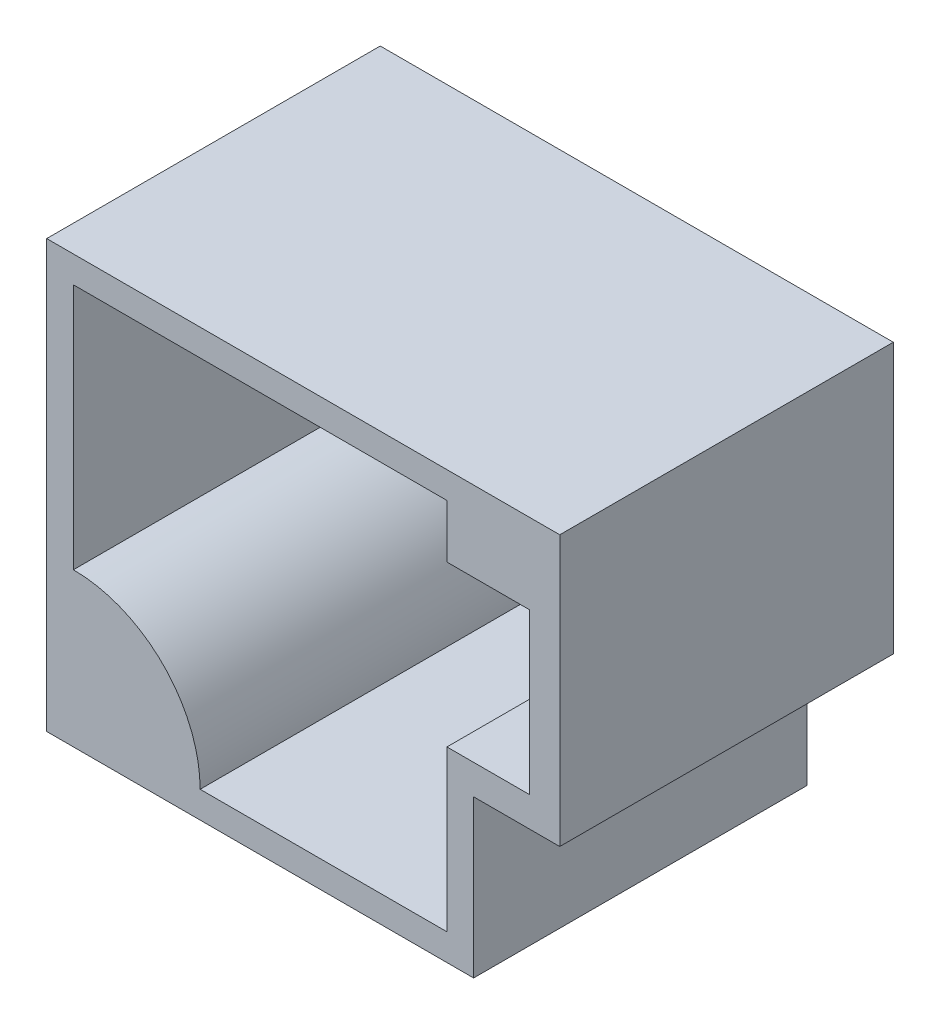
ISO-10303-21;
HEADER;
FILE_DESCRIPTION(('STEP AP214'),'2;1');
FILE_NAME('part.step','',(''),(''),'','','');
FILE_SCHEMA(('AUTOMOTIVE_DESIGN { 1 0 10303 214 1 1 1 1 }'));
ENDSEC;
DATA;
#1=APPLICATION_CONTEXT('core data for automotive mechanical design processes');
#2=APPLICATION_PROTOCOL_DEFINITION('international standard','automotive_design',2000,#1);
#3=PRODUCT_CONTEXT('',#1,'mechanical');
#4=PRODUCT('Part','Part','',(#3));
#5=PRODUCT_RELATED_PRODUCT_CATEGORY('part','',(#4));
#6=PRODUCT_DEFINITION_FORMATION('','',#4);
#7=PRODUCT_DEFINITION_CONTEXT('part definition',#1,'design');
#8=PRODUCT_DEFINITION('design','',#6,#7);
#9=PRODUCT_DEFINITION_SHAPE('','',#8);
#10=(LENGTH_UNIT() NAMED_UNIT(*) SI_UNIT(.MILLI.,.METRE.));
#11=(NAMED_UNIT(*) PLANE_ANGLE_UNIT() SI_UNIT($,.RADIAN.));
#12=(NAMED_UNIT(*) SI_UNIT($,.STERADIAN.) SOLID_ANGLE_UNIT());
#13=UNCERTAINTY_MEASURE_WITH_UNIT(LENGTH_MEASURE(1.E-05),#10,'distance_accuracy_value','');
#14=(GEOMETRIC_REPRESENTATION_CONTEXT(3) GLOBAL_UNCERTAINTY_ASSIGNED_CONTEXT((#13)) GLOBAL_UNIT_ASSIGNED_CONTEXT((#10,
#11,#12)) REPRESENTATION_CONTEXT('',''));
#15=CARTESIAN_POINT('',(0.,0.,0.));
#16=DIRECTION('',(0.,0.,1.));
#17=DIRECTION('',(1.,0.,0.));
#18=AXIS2_PLACEMENT_3D('',#15,#16,#17);
#19=CARTESIAN_POINT('',(202.,-20.,250.));
#20=DIRECTION('',(0.,1.,0.));
#21=DIRECTION('',(-1.,0.,0.));
#22=AXIS2_PLACEMENT_3D('',#19,#20,#21);
#23=PLANE('',#22);
#24=DIRECTION('',(0.,0.,-1.));
#25=VECTOR('',#24,1.);
#26=CARTESIAN_POINT('',(202.,-20.,250.));
#27=LINE('',#26,#25);
#28=CARTESIAN_POINT('',(202.,-20.,250.));
#29=VERTEX_POINT('',#28);
#30=CARTESIAN_POINT('',(202.,-20.,60.));
#31=VERTEX_POINT('',#30);
#32=EDGE_CURVE('E166',#29,#31,#27,.T.);
#33=ORIENTED_EDGE('',*,*,#32,.T.);
#34=DIRECTION('',(-1.,0.,0.));
#35=VECTOR('',#34,1.);
#36=CARTESIAN_POINT('',(202.,-20.,60.));
#37=LINE('',#36,#35);
#38=CARTESIAN_POINT('',(140.,-20.,60.));
#39=VERTEX_POINT('',#38);
#40=EDGE_CURVE('E55',#31,#39,#37,.T.);
#41=ORIENTED_EDGE('',*,*,#40,.T.);
#42=DIRECTION('',(0.,0.,-1.));
#43=VECTOR('',#42,1.);
#44=CARTESIAN_POINT('',(140.,-20.,250.));
#45=LINE('',#44,#43);
#46=CARTESIAN_POINT('',(140.,-20.,250.));
#47=VERTEX_POINT('',#46);
#48=EDGE_CURVE('E153',#47,#39,#45,.T.);
#49=ORIENTED_EDGE('',*,*,#48,.F.);
#50=DIRECTION('',(1.,0.,0.));
#51=VECTOR('',#50,1.);
#52=CARTESIAN_POINT('',(202.,-20.,250.));
#53=LINE('',#52,#51);
#54=EDGE_CURVE('E161',#47,#29,#53,.T.);
#55=ORIENTED_EDGE('',*,*,#54,.T.);
#56=EDGE_LOOP('',(#33,#41,#49,#55));
#57=FACE_BOUND('',#56,.T.);
#58=ADVANCED_FACE('F39',(#57),#23,.T.);
#59=CARTESIAN_POINT('',(202.,100.,250.));
#60=DIRECTION('',(-1.,0.,0.));
#61=DIRECTION('',(0.,-1.,0.));
#62=AXIS2_PLACEMENT_3D('',#59,#60,#61);
#63=PLANE('',#62);
#64=DIRECTION('',(0.,0.,-1.));
#65=VECTOR('',#64,1.);
#66=CARTESIAN_POINT('',(202.,100.,250.));
#67=LINE('',#66,#65);
#68=CARTESIAN_POINT('',(202.,100.,250.));
#69=VERTEX_POINT('',#68);
#70=CARTESIAN_POINT('',(202.,100.,60.));
#71=VERTEX_POINT('',#70);
#72=EDGE_CURVE('E234',#69,#71,#67,.T.);
#73=ORIENTED_EDGE('',*,*,#72,.T.);
#74=DIRECTION('',(0.,-1.,0.));
#75=VECTOR('',#74,1.);
#76=CARTESIAN_POINT('',(202.,100.,60.));
#77=LINE('',#76,#75);
#78=EDGE_CURVE('E63',#71,#31,#77,.T.);
#79=ORIENTED_EDGE('',*,*,#78,.T.);
#80=ORIENTED_EDGE('',*,*,#32,.F.);
#81=DIRECTION('',(0.,1.,0.));
#82=VECTOR('',#81,1.);
#83=CARTESIAN_POINT('',(202.,100.,250.));
#84=LINE('',#83,#82);
#85=EDGE_CURVE('E171',#29,#69,#84,.T.);
#86=ORIENTED_EDGE('',*,*,#85,.T.);
#87=EDGE_LOOP('',(#73,#79,#80,#86));
#88=FACE_BOUND('',#87,.T.);
#89=ADVANCED_FACE('F335',(#88),#63,.T.);
#90=CARTESIAN_POINT('',(140.,100.,250.));
#91=DIRECTION('',(0.,-1.,0.));
#92=DIRECTION('',(0.,0.,-1.));
#93=AXIS2_PLACEMENT_3D('',#90,#91,#92);
#94=PLANE('',#93);
#95=DIRECTION('',(0.,0.,-1.));
#96=VECTOR('',#95,1.);
#97=CARTESIAN_POINT('',(140.,100.,250.));
#98=LINE('',#97,#96);
#99=CARTESIAN_POINT('',(140.,100.,250.));
#100=VERTEX_POINT('',#99);
#101=CARTESIAN_POINT('',(140.,100.,60.));
#102=VERTEX_POINT('',#101);
#103=EDGE_CURVE('E231',#100,#102,#98,.T.);
#104=ORIENTED_EDGE('',*,*,#103,.T.);
#105=DIRECTION('',(1.,0.,0.));
#106=VECTOR('',#105,1.);
#107=CARTESIAN_POINT('',(202.,100.,60.));
#108=LINE('',#107,#106);
#109=EDGE_CURVE('E201',#102,#71,#108,.T.);
#110=ORIENTED_EDGE('',*,*,#109,.T.);
#111=ORIENTED_EDGE('',*,*,#72,.F.);
#112=DIRECTION('',(-1.,0.,0.));
#113=VECTOR('',#112,1.);
#114=CARTESIAN_POINT('',(140.,100.,250.));
#115=LINE('',#114,#113);
#116=EDGE_CURVE('E175',#69,#100,#115,.T.);
#117=ORIENTED_EDGE('',*,*,#116,.T.);
#118=EDGE_LOOP('',(#104,#110,#111,#117));
#119=FACE_BOUND('',#118,.T.);
#120=ADVANCED_FACE('F340',(#119),#94,.T.);
#121=CARTESIAN_POINT('',(0.,0.,250.));
#122=DIRECTION('',(0.,0.,-1.));
#123=DIRECTION('',(-1.,0.,0.));
#124=AXIS2_PLACEMENT_3D('',#121,#122,#123);
#125=PLANE('',#124);
#126=DIRECTION('',(0.,1.,0.));
#127=VECTOR('',#126,1.);
#128=CARTESIAN_POINT('',(160.,-160.,250.));
#129=LINE('',#128,#127);
#130=CARTESIAN_POINT('',(160.,-160.,250.));
#131=VERTEX_POINT('',#130);
#132=CARTESIAN_POINT('',(160.,-42.3686938209738,250.));
#133=VERTEX_POINT('',#132);
#134=EDGE_CURVE('E239',#131,#133,#129,.T.);
#135=ORIENTED_EDGE('',*,*,#134,.T.);
#136=DIRECTION('',(1.,0.,0.));
#137=VECTOR('',#136,1.);
#138=CARTESIAN_POINT('',(160.,-42.3686938209738,250.));
#139=LINE('',#138,#137);
#140=CARTESIAN_POINT('',(224.572052692213,-42.3686938209738,250.));
#141=VERTEX_POINT('',#140);
#142=EDGE_CURVE('E243',#133,#141,#139,.T.);
#143=ORIENTED_EDGE('',*,*,#142,.T.);
#144=DIRECTION('',(0.,1.,0.));
#145=VECTOR('',#144,1.);
#146=CARTESIAN_POINT('',(224.572052692213,-42.3686938209738,250.));
#147=LINE('',#146,#145);
#148=CARTESIAN_POINT('',(224.572052692213,160.,250.));
#149=VERTEX_POINT('',#148);
#150=EDGE_CURVE('E247',#141,#149,#147,.T.);
#151=ORIENTED_EDGE('',*,*,#150,.T.);
#152=DIRECTION('',(-1.,0.,0.));
#153=VECTOR('',#152,1.);
#154=CARTESIAN_POINT('',(224.572052692213,160.,250.));
#155=LINE('',#154,#153);
#156=CARTESIAN_POINT('',(-160.,160.,250.));
#157=VERTEX_POINT('',#156);
#158=EDGE_CURVE('E250',#149,#157,#155,.T.);
#159=ORIENTED_EDGE('',*,*,#158,.T.);
#160=DIRECTION('',(0.,-1.,0.));
#161=VECTOR('',#160,1.);
#162=CARTESIAN_POINT('',(-160.,160.,250.));
#163=LINE('',#162,#161);
#164=CARTESIAN_POINT('',(-160.,-160.,250.));
#165=VERTEX_POINT('',#164);
#166=EDGE_CURVE('E253',#157,#165,#163,.T.);
#167=ORIENTED_EDGE('',*,*,#166,.T.);
#168=DIRECTION('',(1.,0.,0.));
#169=VECTOR('',#168,1.);
#170=CARTESIAN_POINT('',(-160.,-160.,250.));
#171=LINE('',#170,#169);
#172=EDGE_CURVE('E256',#165,#131,#171,.T.);
#173=ORIENTED_EDGE('',*,*,#172,.T.);
#174=EDGE_LOOP('',(#135,#143,#151,#159,#167,#173));
#175=FACE_BOUND('',#174,.T.);
#176=DIRECTION('',(0.,1.,0.));
#177=VECTOR('',#176,1.);
#178=CARTESIAN_POINT('',(140.,-20.,250.));
#179=LINE('',#178,#177);
#180=CARTESIAN_POINT('',(140.,-140.,250.));
#181=VERTEX_POINT('',#180);
#182=EDGE_CURVE('E150',#181,#47,#179,.T.);
#183=ORIENTED_EDGE('',*,*,#182,.F.);
#184=DIRECTION('',(1.,0.,0.));
#185=VECTOR('',#184,1.);
#186=CARTESIAN_POINT('',(-44.9999999999999,-140.,250.));
#187=LINE('',#186,#185);
#188=CARTESIAN_POINT('',(-44.9999999999999,-140.,250.));
#189=VERTEX_POINT('',#188);
#190=EDGE_CURVE('E194',#189,#181,#187,.T.);
#191=ORIENTED_EDGE('',*,*,#190,.F.);
#192=CARTESIAN_POINT('',(-140.,-140.,250.));
#193=DIRECTION('',(0.,0.,-1.));
#194=DIRECTION('',(-1.,0.,0.));
#195=AXIS2_PLACEMENT_3D('',#192,#193,#194);
#196=CIRCLE('',#195,95.0000000000001);
#197=CARTESIAN_POINT('',(-140.,-44.9999999999999,250.));
#198=VERTEX_POINT('',#197);
#199=EDGE_CURVE('E190',#198,#189,#196,.T.);
#200=ORIENTED_EDGE('',*,*,#199,.F.);
#201=DIRECTION('',(0.,-1.,0.));
#202=VECTOR('',#201,1.);
#203=CARTESIAN_POINT('',(-140.,140.,250.));
#204=LINE('',#203,#202);
#205=CARTESIAN_POINT('',(-140.,140.,250.));
#206=VERTEX_POINT('',#205);
#207=EDGE_CURVE('E187',#206,#198,#204,.T.);
#208=ORIENTED_EDGE('',*,*,#207,.F.);
#209=DIRECTION('',(-1.,0.,0.));
#210=VECTOR('',#209,1.);
#211=CARTESIAN_POINT('',(-140.,140.,250.));
#212=LINE('',#211,#210);
#213=CARTESIAN_POINT('',(140.,140.,250.));
#214=VERTEX_POINT('',#213);
#215=EDGE_CURVE('E184',#214,#206,#212,.T.);
#216=ORIENTED_EDGE('',*,*,#215,.F.);
#217=DIRECTION('',(0.,1.,0.));
#218=VECTOR('',#217,1.);
#219=CARTESIAN_POINT('',(140.,140.,250.));
#220=LINE('',#219,#218);
#221=EDGE_CURVE('E181',#100,#214,#220,.T.);
#222=ORIENTED_EDGE('',*,*,#221,.F.);
#223=ORIENTED_EDGE('',*,*,#116,.F.);
#224=ORIENTED_EDGE('',*,*,#85,.F.);
#225=ORIENTED_EDGE('',*,*,#54,.F.);
#226=EDGE_LOOP('',(#183,#191,#200,#208,#216,#222,#223,#224,#225));
#227=FACE_BOUND('',#226,.T.);
#228=ADVANCED_FACE('F169',(#175,#227),#125,.F.);
#229=CARTESIAN_POINT('',(0.,0.,0.));
#230=DIRECTION('',(0.,0.,-1.));
#231=DIRECTION('',(-1.,0.,0.));
#232=AXIS2_PLACEMENT_3D('',#229,#230,#231);
#233=PLANE('',#232);
#234=DIRECTION('',(0.,1.,0.));
#235=VECTOR('',#234,1.);
#236=CARTESIAN_POINT('',(160.,-160.,0.));
#237=LINE('',#236,#235);
#238=CARTESIAN_POINT('',(160.,-160.,0.));
#239=VERTEX_POINT('',#238);
#240=CARTESIAN_POINT('',(160.,-42.3686938209738,0.));
#241=VERTEX_POINT('',#240);
#242=EDGE_CURVE('E165',#239,#241,#237,.T.);
#243=ORIENTED_EDGE('',*,*,#242,.F.);
#244=DIRECTION('',(1.,0.,0.));
#245=VECTOR('',#244,1.);
#246=CARTESIAN_POINT('',(-160.,-160.,0.));
#247=LINE('',#246,#245);
#248=CARTESIAN_POINT('',(-160.,-160.,0.));
#249=VERTEX_POINT('',#248);
#250=EDGE_CURVE('E244',#249,#239,#247,.T.);
#251=ORIENTED_EDGE('',*,*,#250,.F.);
#252=DIRECTION('',(0.,-1.,0.));
#253=VECTOR('',#252,1.);
#254=CARTESIAN_POINT('',(-160.,160.,0.));
#255=LINE('',#254,#253);
#256=CARTESIAN_POINT('',(-160.,160.,0.));
#257=VERTEX_POINT('',#256);
#258=EDGE_CURVE('E272',#257,#249,#255,.T.);
#259=ORIENTED_EDGE('',*,*,#258,.F.);
#260=DIRECTION('',(-1.,0.,0.));
#261=VECTOR('',#260,1.);
#262=CARTESIAN_POINT('',(224.572052692213,160.,0.));
#263=LINE('',#262,#261);
#264=CARTESIAN_POINT('',(224.572052692213,160.,0.));
#265=VERTEX_POINT('',#264);
#266=EDGE_CURVE('E269',#265,#257,#263,.T.);
#267=ORIENTED_EDGE('',*,*,#266,.F.);
#268=DIRECTION('',(0.,1.,0.));
#269=VECTOR('',#268,1.);
#270=CARTESIAN_POINT('',(224.572052692213,-42.3686938209738,0.));
#271=LINE('',#270,#269);
#272=CARTESIAN_POINT('',(224.572052692213,-42.3686938209738,0.));
#273=VERTEX_POINT('',#272);
#274=EDGE_CURVE('E266',#273,#265,#271,.T.);
#275=ORIENTED_EDGE('',*,*,#274,.F.);
#276=DIRECTION('',(1.,0.,0.));
#277=VECTOR('',#276,1.);
#278=CARTESIAN_POINT('',(160.,-42.3686938209738,0.));
#279=LINE('',#278,#277);
#280=EDGE_CURVE('E263',#241,#273,#279,.T.);
#281=ORIENTED_EDGE('',*,*,#280,.F.);
#282=EDGE_LOOP('',(#243,#251,#259,#267,#275,#281));
#283=FACE_BOUND('',#282,.T.);
#284=DIRECTION('',(1.,0.,0.));
#285=VECTOR('',#284,1.);
#286=CARTESIAN_POINT('',(-44.9999999999999,-140.,0.));
#287=LINE('',#286,#285);
#288=CARTESIAN_POINT('',(-44.9999999999999,-140.,0.));
#289=VERTEX_POINT('',#288);
#290=CARTESIAN_POINT('',(140.,-140.,0.));
#291=VERTEX_POINT('',#290);
#292=EDGE_CURVE('E162',#289,#291,#287,.T.);
#293=ORIENTED_EDGE('',*,*,#292,.T.);
#294=DIRECTION('',(0.,1.,0.));
#295=VECTOR('',#294,1.);
#296=CARTESIAN_POINT('',(140.,-20.,0.));
#297=LINE('',#296,#295);
#298=CARTESIAN_POINT('',(140.,140.,0.));
#299=VERTEX_POINT('',#298);
#300=EDGE_CURVE('E197',#291,#299,#297,.T.);
#301=ORIENTED_EDGE('',*,*,#300,.T.);
#302=DIRECTION('',(-1.,0.,0.));
#303=VECTOR('',#302,1.);
#304=CARTESIAN_POINT('',(-140.,140.,0.));
#305=LINE('',#304,#303);
#306=CARTESIAN_POINT('',(-140.,140.,0.));
#307=VERTEX_POINT('',#306);
#308=EDGE_CURVE('E200',#299,#307,#305,.T.);
#309=ORIENTED_EDGE('',*,*,#308,.T.);
#310=DIRECTION('',(0.,-1.,0.));
#311=VECTOR('',#310,1.);
#312=CARTESIAN_POINT('',(-140.,140.,0.));
#313=LINE('',#312,#311);
#314=CARTESIAN_POINT('',(-140.,-44.9999999999999,0.));
#315=VERTEX_POINT('',#314);
#316=EDGE_CURVE('E205',#307,#315,#313,.T.);
#317=ORIENTED_EDGE('',*,*,#316,.T.);
#318=CARTESIAN_POINT('',(-140.,-140.,0.));
#319=DIRECTION('',(0.,0.,-1.));
#320=DIRECTION('',(-1.,0.,0.));
#321=AXIS2_PLACEMENT_3D('',#318,#319,#320);
#322=CIRCLE('',#321,95.0000000000001);
#323=EDGE_CURVE('E209',#315,#289,#322,.T.);
#324=ORIENTED_EDGE('',*,*,#323,.T.);
#325=EDGE_LOOP('',(#293,#301,#309,#317,#324));
#326=FACE_BOUND('',#325,.T.);
#327=ADVANCED_FACE('F303',(#283,#326),#233,.T.);
#328=CARTESIAN_POINT('',(160.,-160.,250.));
#329=DIRECTION('',(-1.,0.,0.));
#330=DIRECTION('',(0.,0.,1.));
#331=AXIS2_PLACEMENT_3D('',#328,#329,#330);
#332=PLANE('',#331);
#333=ORIENTED_EDGE('',*,*,#242,.T.);
#334=DIRECTION('',(0.,0.,-1.));
#335=VECTOR('',#334,1.);
#336=CARTESIAN_POINT('',(160.,-42.3686938209738,250.));
#337=LINE('',#336,#335);
#338=EDGE_CURVE('E11',#133,#241,#337,.T.);
#339=ORIENTED_EDGE('',*,*,#338,.F.);
#340=ORIENTED_EDGE('',*,*,#134,.F.);
#341=DIRECTION('',(0.,0.,-1.));
#342=VECTOR('',#341,1.);
#343=CARTESIAN_POINT('',(160.,-160.,250.));
#344=LINE('',#343,#342);
#345=EDGE_CURVE('E259',#131,#239,#344,.T.);
#346=ORIENTED_EDGE('',*,*,#345,.T.);
#347=EDGE_LOOP('',(#333,#339,#340,#346));
#348=FACE_BOUND('',#347,.T.);
#349=ADVANCED_FACE('F41',(#348),#332,.F.);
#350=CARTESIAN_POINT('',(160.,-42.3686938209738,250.));
#351=DIRECTION('',(0.,1.,0.));
#352=DIRECTION('',(0.,0.,1.));
#353=AXIS2_PLACEMENT_3D('',#350,#351,#352);
#354=PLANE('',#353);
#355=ORIENTED_EDGE('',*,*,#280,.T.);
#356=DIRECTION('',(0.,0.,-1.));
#357=VECTOR('',#356,1.);
#358=CARTESIAN_POINT('',(224.572052692213,-42.3686938209738,250.));
#359=LINE('',#358,#357);
#360=EDGE_CURVE('E48',#141,#273,#359,.T.);
#361=ORIENTED_EDGE('',*,*,#360,.F.);
#362=ORIENTED_EDGE('',*,*,#142,.F.);
#363=ORIENTED_EDGE('',*,*,#338,.T.);
#364=EDGE_LOOP('',(#355,#361,#362,#363));
#365=FACE_BOUND('',#364,.T.);
#366=ADVANCED_FACE('F320',(#365),#354,.F.);
#367=CARTESIAN_POINT('',(224.572052692213,-42.3686938209738,250.));
#368=DIRECTION('',(-1.,0.,0.));
#369=DIRECTION('',(0.,0.,1.));
#370=AXIS2_PLACEMENT_3D('',#367,#368,#369);
#371=PLANE('',#370);
#372=ORIENTED_EDGE('',*,*,#274,.T.);
#373=DIRECTION('',(0.,0.,-1.));
#374=VECTOR('',#373,1.);
#375=CARTESIAN_POINT('',(224.572052692213,160.,250.));
#376=LINE('',#375,#374);
#377=EDGE_CURVE('E288',#149,#265,#376,.T.);
#378=ORIENTED_EDGE('',*,*,#377,.F.);
#379=ORIENTED_EDGE('',*,*,#150,.F.);
#380=ORIENTED_EDGE('',*,*,#360,.T.);
#381=EDGE_LOOP('',(#372,#378,#379,#380));
#382=FACE_BOUND('',#381,.T.);
#383=ADVANCED_FACE('F297',(#382),#371,.F.);
#384=CARTESIAN_POINT('',(224.572052692213,160.,250.));
#385=DIRECTION('',(0.,-1.,0.));
#386=DIRECTION('',(1.,0.,0.));
#387=AXIS2_PLACEMENT_3D('',#384,#385,#386);
#388=PLANE('',#387);
#389=ORIENTED_EDGE('',*,*,#266,.T.);
#390=DIRECTION('',(0.,0.,-1.));
#391=VECTOR('',#390,1.);
#392=CARTESIAN_POINT('',(-160.,160.,250.));
#393=LINE('',#392,#391);
#394=EDGE_CURVE('E284',#157,#257,#393,.T.);
#395=ORIENTED_EDGE('',*,*,#394,.F.);
#396=ORIENTED_EDGE('',*,*,#158,.F.);
#397=ORIENTED_EDGE('',*,*,#377,.T.);
#398=EDGE_LOOP('',(#389,#395,#396,#397));
#399=FACE_BOUND('',#398,.T.);
#400=ADVANCED_FACE('F309',(#399),#388,.F.);
#401=CARTESIAN_POINT('',(-160.,160.,250.));
#402=DIRECTION('',(1.,0.,0.));
#403=DIRECTION('',(0.,0.,-1.));
#404=AXIS2_PLACEMENT_3D('',#401,#402,#403);
#405=PLANE('',#404);
#406=ORIENTED_EDGE('',*,*,#258,.T.);
#407=DIRECTION('',(0.,0.,-1.));
#408=VECTOR('',#407,1.);
#409=CARTESIAN_POINT('',(-160.,-160.,250.));
#410=LINE('',#409,#408);
#411=EDGE_CURVE('E280',#165,#249,#410,.T.);
#412=ORIENTED_EDGE('',*,*,#411,.F.);
#413=ORIENTED_EDGE('',*,*,#166,.F.);
#414=ORIENTED_EDGE('',*,*,#394,.T.);
#415=EDGE_LOOP('',(#406,#412,#413,#414));
#416=FACE_BOUND('',#415,.T.);
#417=ADVANCED_FACE('F313',(#416),#405,.F.);
#418=CARTESIAN_POINT('',(-160.,-160.,250.));
#419=DIRECTION('',(0.,1.,0.));
#420=DIRECTION('',(0.,0.,1.));
#421=AXIS2_PLACEMENT_3D('',#418,#419,#420);
#422=PLANE('',#421);
#423=ORIENTED_EDGE('',*,*,#250,.T.);
#424=ORIENTED_EDGE('',*,*,#345,.F.);
#425=ORIENTED_EDGE('',*,*,#172,.F.);
#426=ORIENTED_EDGE('',*,*,#411,.T.);
#427=EDGE_LOOP('',(#423,#424,#425,#426));
#428=FACE_BOUND('',#427,.T.);
#429=ADVANCED_FACE('F323',(#428),#422,.F.);
#430=CARTESIAN_POINT('',(140.,-20.,250.));
#431=DIRECTION('',(-1.,0.,0.));
#432=DIRECTION('',(0.,-1.,0.));
#433=AXIS2_PLACEMENT_3D('',#430,#431,#432);
#434=PLANE('',#433);
#435=ORIENTED_EDGE('',*,*,#300,.F.);
#436=DIRECTION('',(0.,0.,-1.));
#437=VECTOR('',#436,1.);
#438=CARTESIAN_POINT('',(140.,-140.,250.));
#439=LINE('',#438,#437);
#440=EDGE_CURVE('E156',#181,#291,#439,.T.);
#441=ORIENTED_EDGE('',*,*,#440,.F.);
#442=ORIENTED_EDGE('',*,*,#182,.T.);
#443=ORIENTED_EDGE('',*,*,#48,.T.);
#444=DIRECTION('',(0.,1.,0.));
#445=VECTOR('',#444,1.);
#446=CARTESIAN_POINT('',(140.,100.,60.));
#447=LINE('',#446,#445);
#448=EDGE_CURVE('E458',#39,#102,#447,.T.);
#449=ORIENTED_EDGE('',*,*,#448,.T.);
#450=ORIENTED_EDGE('',*,*,#103,.F.);
#451=ORIENTED_EDGE('',*,*,#221,.T.);
#452=DIRECTION('',(0.,0.,-1.));
#453=VECTOR('',#452,1.);
#454=CARTESIAN_POINT('',(140.,140.,250.));
#455=LINE('',#454,#453);
#456=EDGE_CURVE('E227',#214,#299,#455,.T.);
#457=ORIENTED_EDGE('',*,*,#456,.T.);
#458=EDGE_LOOP('',(#435,#441,#442,#443,#449,#450,#451,#457));
#459=FACE_BOUND('',#458,.T.);
#460=ADVANCED_FACE('F151',(#459),#434,.T.);
#461=CARTESIAN_POINT('',(-140.,140.,250.));
#462=DIRECTION('',(0.,-1.,0.));
#463=DIRECTION('',(0.,0.,-1.));
#464=AXIS2_PLACEMENT_3D('',#461,#462,#463);
#465=PLANE('',#464);
#466=ORIENTED_EDGE('',*,*,#308,.F.);
#467=ORIENTED_EDGE('',*,*,#456,.F.);
#468=ORIENTED_EDGE('',*,*,#215,.T.);
#469=DIRECTION('',(0.,0.,-1.));
#470=VECTOR('',#469,1.);
#471=CARTESIAN_POINT('',(-140.,140.,250.));
#472=LINE('',#471,#470);
#473=EDGE_CURVE('E224',#206,#307,#472,.T.);
#474=ORIENTED_EDGE('',*,*,#473,.T.);
#475=EDGE_LOOP('',(#466,#467,#468,#474));
#476=FACE_BOUND('',#475,.T.);
#477=ADVANCED_FACE('F330',(#476),#465,.T.);
#478=CARTESIAN_POINT('',(-140.,140.,250.));
#479=DIRECTION('',(1.,0.,0.));
#480=DIRECTION('',(0.,0.,-1.));
#481=AXIS2_PLACEMENT_3D('',#478,#479,#480);
#482=PLANE('',#481);
#483=ORIENTED_EDGE('',*,*,#316,.F.);
#484=ORIENTED_EDGE('',*,*,#473,.F.);
#485=ORIENTED_EDGE('',*,*,#207,.T.);
#486=DIRECTION('',(0.,0.,-1.));
#487=VECTOR('',#486,1.);
#488=CARTESIAN_POINT('',(-140.,-44.9999999999999,250.));
#489=LINE('',#488,#487);
#490=EDGE_CURVE('E221',#198,#315,#489,.T.);
#491=ORIENTED_EDGE('',*,*,#490,.T.);
#492=EDGE_LOOP('',(#483,#484,#485,#491));
#493=FACE_BOUND('',#492,.T.);
#494=ADVANCED_FACE('F380',(#493),#482,.T.);
#495=CARTESIAN_POINT('',(-140.,-140.,250.));
#496=DIRECTION('',(0.,0.,-1.));
#497=DIRECTION('',(-1.,0.,0.));
#498=AXIS2_PLACEMENT_3D('',#495,#496,#497);
#499=CYLINDRICAL_SURFACE('',#498,95.0000000000001);
#500=ORIENTED_EDGE('',*,*,#323,.F.);
#501=ORIENTED_EDGE('',*,*,#490,.F.);
#502=ORIENTED_EDGE('',*,*,#199,.T.);
#503=DIRECTION('',(0.,0.,-1.));
#504=VECTOR('',#503,1.);
#505=CARTESIAN_POINT('',(-44.9999999999999,-140.,250.));
#506=LINE('',#505,#504);
#507=EDGE_CURVE('E218',#189,#289,#506,.T.);
#508=ORIENTED_EDGE('',*,*,#507,.T.);
#509=EDGE_LOOP('',(#500,#501,#502,#508));
#510=FACE_BOUND('',#509,.T.);
#511=ADVANCED_FACE('F390',(#510),#499,.T.);
#512=CARTESIAN_POINT('',(-44.9999999999999,-140.,250.));
#513=DIRECTION('',(0.,1.,0.));
#514=DIRECTION('',(0.,0.,1.));
#515=AXIS2_PLACEMENT_3D('',#512,#513,#514);
#516=PLANE('',#515);
#517=ORIENTED_EDGE('',*,*,#292,.F.);
#518=ORIENTED_EDGE('',*,*,#507,.F.);
#519=ORIENTED_EDGE('',*,*,#190,.T.);
#520=ORIENTED_EDGE('',*,*,#440,.T.);
#521=EDGE_LOOP('',(#517,#518,#519,#520));
#522=FACE_BOUND('',#521,.T.);
#523=ADVANCED_FACE('F400',(#522),#516,.T.);
#524=CARTESIAN_POINT('',(0.,0.,60.));
#525=DIRECTION('',(0.,0.,-1.));
#526=DIRECTION('',(-1.,0.,0.));
#527=AXIS2_PLACEMENT_3D('',#524,#525,#526);
#528=PLANE('',#527);
#529=ORIENTED_EDGE('',*,*,#78,.F.);
#530=ORIENTED_EDGE('',*,*,#109,.F.);
#531=ORIENTED_EDGE('',*,*,#448,.F.);
#532=ORIENTED_EDGE('',*,*,#40,.F.);
#533=EDGE_LOOP('',(#529,#530,#531,#532));
#534=FACE_BOUND('',#533,.T.);
#535=ADVANCED_FACE('F409',(#534),#528,.F.);
#536=CLOSED_SHELL('',(#58,#89,#120,#228,#327,#349,#366,#383,#400,#417,#429,#460,#477,#494,#511,
#523,#535));
#537=MANIFOLD_SOLID_BREP('B2',#536);
#538=ADVANCED_BREP_SHAPE_REPRESENTATION('',(#18,#537),#14);
#539=SHAPE_DEFINITION_REPRESENTATION(#9,#538);
ENDSEC;
END-ISO-10303-21;
